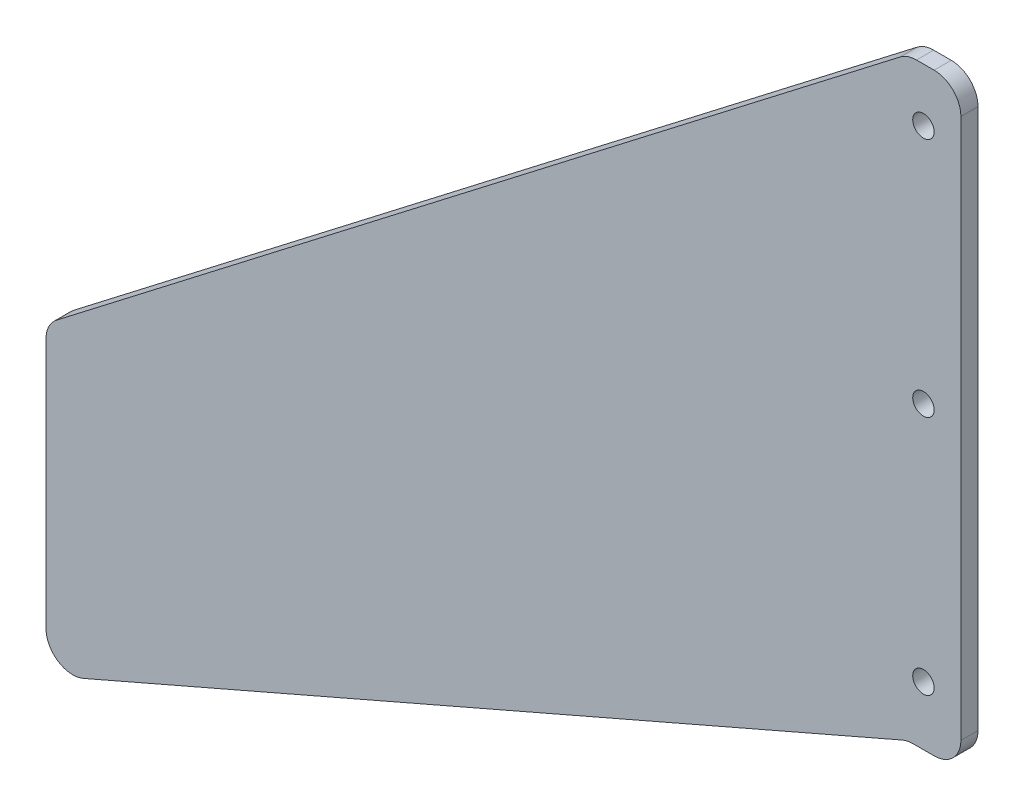
ISO-10303-21;
HEADER;
FILE_DESCRIPTION(('STEP AP214'),'2;1');
FILE_NAME('part.step','',(''),(''),'','','');
FILE_SCHEMA(('AUTOMOTIVE_DESIGN { 1 0 10303 214 1 1 1 1 }'));
ENDSEC;
DATA;
#1=APPLICATION_CONTEXT('core data for automotive mechanical design processes');
#2=APPLICATION_PROTOCOL_DEFINITION('international standard','automotive_design',2000,#1);
#3=PRODUCT_CONTEXT('',#1,'mechanical');
#4=PRODUCT('Part','Part','',(#3));
#5=PRODUCT_RELATED_PRODUCT_CATEGORY('part','',(#4));
#6=PRODUCT_DEFINITION_FORMATION('','',#4);
#7=PRODUCT_DEFINITION_CONTEXT('part definition',#1,'design');
#8=PRODUCT_DEFINITION('design','',#6,#7);
#9=PRODUCT_DEFINITION_SHAPE('','',#8);
#10=(LENGTH_UNIT() NAMED_UNIT(*) SI_UNIT(.MILLI.,.METRE.));
#11=(NAMED_UNIT(*) PLANE_ANGLE_UNIT() SI_UNIT($,.RADIAN.));
#12=(NAMED_UNIT(*) SI_UNIT($,.STERADIAN.) SOLID_ANGLE_UNIT());
#13=UNCERTAINTY_MEASURE_WITH_UNIT(LENGTH_MEASURE(1.E-05),#10,'distance_accuracy_value','');
#14=(GEOMETRIC_REPRESENTATION_CONTEXT(3) GLOBAL_UNCERTAINTY_ASSIGNED_CONTEXT((#13)) GLOBAL_UNIT_ASSIGNED_CONTEXT((#10,
#11,#12)) REPRESENTATION_CONTEXT('',''));
#15=CARTESIAN_POINT('',(0.,0.,0.));
#16=DIRECTION('',(0.,0.,1.));
#17=DIRECTION('',(1.,0.,0.));
#18=AXIS2_PLACEMENT_3D('',#15,#16,#17);
#19=CARTESIAN_POINT('',(-1.29771640413357,4.99999999999951,1.6));
#20=DIRECTION('',(0.,0.,1.));
#21=DIRECTION('',(1.,0.,0.));
#22=AXIS2_PLACEMENT_3D('',#19,#20,#21);
#23=PLANE('',#22);
#24=CARTESIAN_POINT('',(-8.19440001964544E-13,-45.0000000000005,1.6));
#25=DIRECTION('',(0.,0.,1.));
#26=DIRECTION('',(1.,0.,0.));
#27=AXIS2_PLACEMENT_3D('',#24,#25,#26);
#28=CIRCLE('',#27,2.);
#29=CARTESIAN_POINT('',(1.99999999999918,-45.0000000000005,1.6));
#30=VERTEX_POINT('',#29);
#31=EDGE_CURVE('E183',#30,#30,#28,.T.);
#32=ORIENTED_EDGE('',*,*,#31,.F.);
#33=EDGE_LOOP('',(#32));
#34=FACE_BOUND('',#33,.T.);
#35=CARTESIAN_POINT('',(-1.29771640413357,4.99999999999951,1.6));
#36=DIRECTION('',(0.,0.,1.));
#37=DIRECTION('',(1.,0.,0.));
#38=AXIS2_PLACEMENT_3D('',#35,#36,#37);
#39=CIRCLE('',#38,5.00000000000015);
#40=CARTESIAN_POINT('',(-1.29771640413357,9.99999999999984,1.6));
#41=VERTEX_POINT('',#40);
#42=CARTESIAN_POINT('',(-4.34864776888282,8.9612899171337,1.6));
#43=VERTEX_POINT('',#42);
#44=EDGE_CURVE('E189',#41,#43,#39,.T.);
#45=ORIENTED_EDGE('',*,*,#44,.T.);
#46=DIRECTION('',(-0.792257983426843,-0.610186272949853,0.));
#47=VECTOR('',#46,1.);
#48=CARTESIAN_POINT('',(-4.34864776888282,8.9612899171337,1.6));
#49=LINE('',#48,#47);
#50=CARTESIAN_POINT('',(-162.050931364752,-112.498853970365,1.6));
#51=VERTEX_POINT('',#50);
#52=EDGE_CURVE('E130',#43,#51,#49,.T.);
#53=ORIENTED_EDGE('',*,*,#52,.T.);
#54=CARTESIAN_POINT('',(-159.000000000003,-116.460143887499,1.6));
#55=DIRECTION('',(0.,0.,1.));
#56=DIRECTION('',(1.,0.,0.));
#57=AXIS2_PLACEMENT_3D('',#54,#55,#56);
#58=CIRCLE('',#57,4.99999999999997);
#59=CARTESIAN_POINT('',(-164.000000000002,-116.460143887499,1.6));
#60=VERTEX_POINT('',#59);
#61=EDGE_CURVE('E192',#51,#60,#58,.T.);
#62=ORIENTED_EDGE('',*,*,#61,.T.);
#63=DIRECTION('',(0.,-1.,0.));
#64=VECTOR('',#63,1.);
#65=CARTESIAN_POINT('',(-164.000000000002,-116.460143887499,1.6));
#66=LINE('',#65,#64);
#67=CARTESIAN_POINT('',(-164.000000000003,-163.373940780875,1.6));
#68=VERTEX_POINT('',#67);
#69=EDGE_CURVE('E194',#60,#68,#66,.T.);
#70=ORIENTED_EDGE('',*,*,#69,.T.);
#71=CARTESIAN_POINT('',(-159.000000000003,-163.373940780876,1.6));
#72=DIRECTION('',(0.,0.,1.));
#73=DIRECTION('',(1.,0.,0.));
#74=AXIS2_PLACEMENT_3D('',#71,#72,#73);
#75=CIRCLE('',#74,5.00000000000006);
#76=CARTESIAN_POINT('',(-157.006369442931,-167.959291062142,1.6));
#77=VERTEX_POINT('',#76);
#78=EDGE_CURVE('E196',#68,#77,#75,.T.);
#79=ORIENTED_EDGE('',*,*,#78,.T.);
#80=DIRECTION('',(0.917070056253239,0.398726111414441,0.));
#81=VECTOR('',#80,1.);
#82=CARTESIAN_POINT('',(-157.006369442931,-167.959291062142,1.6));
#83=LINE('',#82,#81);
#84=CARTESIAN_POINT('',(-3.95369435308959,-101.414649718734,1.6));
#85=VERTEX_POINT('',#84);
#86=EDGE_CURVE('E198',#77,#85,#83,.T.);
#87=ORIENTED_EDGE('',*,*,#86,.T.);
#88=CARTESIAN_POINT('',(-1.96006379601695,-106.000000000001,1.6));
#89=DIRECTION('',(0.,0.,-1.));
#90=DIRECTION('',(1.,0.,0.));
#91=AXIS2_PLACEMENT_3D('',#88,#89,#90);
#92=CIRCLE('',#91,5.00000000000025);
#93=CARTESIAN_POINT('',(-1.96006379601744,-101.000000000001,1.6));
#94=VERTEX_POINT('',#93);
#95=EDGE_CURVE('E200',#85,#94,#92,.T.);
#96=ORIENTED_EDGE('',*,*,#95,.T.);
#97=DIRECTION('',(1.,0.,0.));
#98=VECTOR('',#97,1.);
#99=CARTESIAN_POINT('',(-1.96006379601744,-101.000000000001,1.6));
#100=LINE('',#99,#98);
#101=CARTESIAN_POINT('',(1.99999999999848,-101.000000000001,1.6));
#102=VERTEX_POINT('',#101);
#103=EDGE_CURVE('E202',#94,#102,#100,.T.);
#104=ORIENTED_EDGE('',*,*,#103,.T.);
#105=CARTESIAN_POINT('',(1.99999999999824,-96.0000000000007,1.6));
#106=DIRECTION('',(0.,0.,1.));
#107=DIRECTION('',(1.,0.,0.));
#108=AXIS2_PLACEMENT_3D('',#105,#106,#107);
#109=CIRCLE('',#108,4.9999999999999);
#110=CARTESIAN_POINT('',(6.99999999999853,-96.0000000000009,1.6));
#111=VERTEX_POINT('',#110);
#112=EDGE_CURVE('E204',#102,#111,#109,.T.);
#113=ORIENTED_EDGE('',*,*,#112,.T.);
#114=DIRECTION('',(0.,1.,0.));
#115=VECTOR('',#114,1.);
#116=CARTESIAN_POINT('',(6.99999999999853,-96.0000000000009,1.6));
#117=LINE('',#116,#115);
#118=CARTESIAN_POINT('',(6.99999999999945,4.99999999999943,1.6));
#119=VERTEX_POINT('',#118);
#120=EDGE_CURVE('E206',#111,#119,#117,.T.);
#121=ORIENTED_EDGE('',*,*,#120,.T.);
#122=CARTESIAN_POINT('',(1.99999999999925,4.99999999999962,1.6));
#123=DIRECTION('',(0.,0.,1.));
#124=DIRECTION('',(1.,0.,0.));
#125=AXIS2_PLACEMENT_3D('',#122,#123,#124);
#126=CIRCLE('',#125,5.0000000000002);
#127=CARTESIAN_POINT('',(1.9999999999994,9.99999999999984,1.6));
#128=VERTEX_POINT('',#127);
#129=EDGE_CURVE('E58',#119,#128,#126,.T.);
#130=ORIENTED_EDGE('',*,*,#129,.T.);
#131=DIRECTION('',(-1.,0.,0.));
#132=VECTOR('',#131,1.);
#133=CARTESIAN_POINT('',(1.9999999999994,9.99999999999984,1.6));
#134=LINE('',#133,#132);
#135=EDGE_CURVE('E53',#128,#41,#134,.T.);
#136=ORIENTED_EDGE('',*,*,#135,.T.);
#137=EDGE_LOOP('',(#45,#53,#62,#70,#79,#87,#96,#104,#113,#121,#130,#136));
#138=FACE_BOUND('',#137,.T.);
#139=CARTESIAN_POINT('',(0.,0.,1.6));
#140=DIRECTION('',(0.,0.,1.));
#141=DIRECTION('',(1.,0.,0.));
#142=AXIS2_PLACEMENT_3D('',#139,#140,#141);
#143=CIRCLE('',#142,2.00000000000001);
#144=CARTESIAN_POINT('',(2.00000000000001,0.,1.6));
#145=VERTEX_POINT('',#144);
#146=EDGE_CURVE('E186',#145,#145,#143,.T.);
#147=ORIENTED_EDGE('',*,*,#146,.F.);
#148=EDGE_LOOP('',(#147));
#149=FACE_BOUND('',#148,.T.);
#150=CARTESIAN_POINT('',(-1.19956128363796E-12,-90.0000000000008,1.6));
#151=DIRECTION('',(0.,0.,1.));
#152=DIRECTION('',(1.,0.,0.));
#153=AXIS2_PLACEMENT_3D('',#150,#151,#152);
#154=CIRCLE('',#153,2.);
#155=CARTESIAN_POINT('',(1.9999999999988,-90.0000000000008,1.6));
#156=VERTEX_POINT('',#155);
#157=EDGE_CURVE('E180',#156,#156,#154,.T.);
#158=ORIENTED_EDGE('',*,*,#157,.F.);
#159=EDGE_LOOP('',(#158));
#160=FACE_BOUND('',#159,.T.);
#161=ADVANCED_FACE('F38',(#34,#138,#149,#160),#23,.T.);
#162=CARTESIAN_POINT('',(-1.29771640413357,4.99999999999951,1.6));
#163=DIRECTION('',(0.,0.,-1.));
#164=DIRECTION('',(-1.,0.,0.));
#165=AXIS2_PLACEMENT_3D('',#162,#163,#164);
#166=CYLINDRICAL_SURFACE('',#165,5.00000000000015);
#167=DIRECTION('',(0.,0.,-1.));
#168=VECTOR('',#167,1.);
#169=CARTESIAN_POINT('',(-1.29771640413357,9.99999999999984,1.6));
#170=LINE('',#169,#168);
#171=CARTESIAN_POINT('',(-1.29771640413357,9.99999999999984,-1.6));
#172=VERTEX_POINT('',#171);
#173=EDGE_CURVE('E145',#41,#172,#170,.T.);
#174=ORIENTED_EDGE('',*,*,#173,.T.);
#175=CARTESIAN_POINT('',(-1.29771640413357,4.99999999999951,-1.6));
#176=DIRECTION('',(0.,0.,1.));
#177=DIRECTION('',(1.,0.,0.));
#178=AXIS2_PLACEMENT_3D('',#175,#176,#177);
#179=CIRCLE('',#178,5.00000000000015);
#180=CARTESIAN_POINT('',(-4.34864776888282,8.9612899171337,-1.6));
#181=VERTEX_POINT('',#180);
#182=EDGE_CURVE('E139',#172,#181,#179,.T.);
#183=ORIENTED_EDGE('',*,*,#182,.T.);
#184=DIRECTION('',(0.,0.,-1.));
#185=VECTOR('',#184,1.);
#186=CARTESIAN_POINT('',(-4.34864776888282,8.9612899171337,1.6));
#187=LINE('',#186,#185);
#188=EDGE_CURVE('E11',#43,#181,#187,.T.);
#189=ORIENTED_EDGE('',*,*,#188,.F.);
#190=ORIENTED_EDGE('',*,*,#44,.F.);
#191=EDGE_LOOP('',(#174,#183,#189,#190));
#192=FACE_BOUND('',#191,.T.);
#193=ADVANCED_FACE('F40',(#192),#166,.T.);
#194=CARTESIAN_POINT('',(-4.34864776888282,8.9612899171337,1.6));
#195=DIRECTION('',(0.610186272949852,-0.792257983426843,0.));
#196=DIRECTION('',(0.792257983426843,0.610186272949853,0.));
#197=AXIS2_PLACEMENT_3D('',#194,#195,#196);
#198=PLANE('',#197);
#199=ORIENTED_EDGE('',*,*,#188,.T.);
#200=DIRECTION('',(-0.792257983426843,-0.610186272949853,0.));
#201=VECTOR('',#200,1.);
#202=CARTESIAN_POINT('',(-4.34864776888282,8.9612899171337,-1.6));
#203=LINE('',#202,#201);
#204=CARTESIAN_POINT('',(-162.050931364752,-112.498853970365,-1.6));
#205=VERTEX_POINT('',#204);
#206=EDGE_CURVE('E129',#181,#205,#203,.T.);
#207=ORIENTED_EDGE('',*,*,#206,.T.);
#208=DIRECTION('',(0.,0.,-1.));
#209=VECTOR('',#208,1.);
#210=CARTESIAN_POINT('',(-162.050931364752,-112.498853970365,1.6));
#211=LINE('',#210,#209);
#212=EDGE_CURVE('E46',#51,#205,#211,.T.);
#213=ORIENTED_EDGE('',*,*,#212,.F.);
#214=ORIENTED_EDGE('',*,*,#52,.F.);
#215=EDGE_LOOP('',(#199,#207,#213,#214));
#216=FACE_BOUND('',#215,.T.);
#217=ADVANCED_FACE('F127',(#216),#198,.F.);
#218=CARTESIAN_POINT('',(-159.000000000003,-116.460143887499,1.6));
#219=DIRECTION('',(0.,0.,-1.));
#220=DIRECTION('',(-1.,0.,0.));
#221=AXIS2_PLACEMENT_3D('',#218,#219,#220);
#222=CYLINDRICAL_SURFACE('',#221,4.99999999999997);
#223=ORIENTED_EDGE('',*,*,#212,.T.);
#224=CARTESIAN_POINT('',(-159.000000000003,-116.460143887499,-1.6));
#225=DIRECTION('',(0.,0.,1.));
#226=DIRECTION('',(1.,0.,0.));
#227=AXIS2_PLACEMENT_3D('',#224,#225,#226);
#228=CIRCLE('',#227,4.99999999999997);
#229=CARTESIAN_POINT('',(-164.000000000002,-116.460143887499,-1.6));
#230=VERTEX_POINT('',#229);
#231=EDGE_CURVE('E143',#205,#230,#228,.T.);
#232=ORIENTED_EDGE('',*,*,#231,.T.);
#233=DIRECTION('',(0.,0.,-1.));
#234=VECTOR('',#233,1.);
#235=CARTESIAN_POINT('',(-164.000000000002,-116.460143887499,1.6));
#236=LINE('',#235,#234);
#237=EDGE_CURVE('E227',#60,#230,#236,.T.);
#238=ORIENTED_EDGE('',*,*,#237,.F.);
#239=ORIENTED_EDGE('',*,*,#61,.F.);
#240=EDGE_LOOP('',(#223,#232,#238,#239));
#241=FACE_BOUND('',#240,.T.);
#242=ADVANCED_FACE('F230',(#241),#222,.T.);
#243=CARTESIAN_POINT('',(-164.000000000002,-116.460143887499,1.6));
#244=DIRECTION('',(1.,0.,0.));
#245=DIRECTION('',(0.,1.,0.));
#246=AXIS2_PLACEMENT_3D('',#243,#244,#245);
#247=PLANE('',#246);
#248=ORIENTED_EDGE('',*,*,#237,.T.);
#249=DIRECTION('',(0.,-1.,0.));
#250=VECTOR('',#249,1.);
#251=CARTESIAN_POINT('',(-164.000000000002,-116.460143887499,-1.6));
#252=LINE('',#251,#250);
#253=CARTESIAN_POINT('',(-164.000000000003,-163.373940780875,-1.6));
#254=VERTEX_POINT('',#253);
#255=EDGE_CURVE('E154',#230,#254,#252,.T.);
#256=ORIENTED_EDGE('',*,*,#255,.T.);
#257=DIRECTION('',(0.,0.,-1.));
#258=VECTOR('',#257,1.);
#259=CARTESIAN_POINT('',(-164.000000000003,-163.373940780875,1.6));
#260=LINE('',#259,#258);
#261=EDGE_CURVE('E225',#68,#254,#260,.T.);
#262=ORIENTED_EDGE('',*,*,#261,.F.);
#263=ORIENTED_EDGE('',*,*,#69,.F.);
#264=EDGE_LOOP('',(#248,#256,#262,#263));
#265=FACE_BOUND('',#264,.T.);
#266=ADVANCED_FACE('F238',(#265),#247,.F.);
#267=CARTESIAN_POINT('',(-159.000000000003,-163.373940780876,1.6));
#268=DIRECTION('',(0.,0.,-1.));
#269=DIRECTION('',(-1.,0.,0.));
#270=AXIS2_PLACEMENT_3D('',#267,#268,#269);
#271=CYLINDRICAL_SURFACE('',#270,5.00000000000006);
#272=ORIENTED_EDGE('',*,*,#261,.T.);
#273=CARTESIAN_POINT('',(-159.000000000003,-163.373940780876,-1.6));
#274=DIRECTION('',(0.,0.,1.));
#275=DIRECTION('',(1.,0.,0.));
#276=AXIS2_PLACEMENT_3D('',#273,#274,#275);
#277=CIRCLE('',#276,5.00000000000006);
#278=CARTESIAN_POINT('',(-157.006369442931,-167.959291062142,-1.6));
#279=VERTEX_POINT('',#278);
#280=EDGE_CURVE('E157',#254,#279,#277,.T.);
#281=ORIENTED_EDGE('',*,*,#280,.T.);
#282=DIRECTION('',(0.,0.,-1.));
#283=VECTOR('',#282,1.);
#284=CARTESIAN_POINT('',(-157.006369442931,-167.959291062142,1.6));
#285=LINE('',#284,#283);
#286=EDGE_CURVE('E223',#77,#279,#285,.T.);
#287=ORIENTED_EDGE('',*,*,#286,.F.);
#288=ORIENTED_EDGE('',*,*,#78,.F.);
#289=EDGE_LOOP('',(#272,#281,#287,#288));
#290=FACE_BOUND('',#289,.T.);
#291=ADVANCED_FACE('F241',(#290),#271,.T.);
#292=CARTESIAN_POINT('',(-157.006369442931,-167.959291062142,1.6));
#293=DIRECTION('',(-0.398726111414441,0.917070056253239,0.));
#294=DIRECTION('',(-0.917070056253239,-0.398726111414441,0.));
#295=AXIS2_PLACEMENT_3D('',#292,#293,#294);
#296=PLANE('',#295);
#297=ORIENTED_EDGE('',*,*,#286,.T.);
#298=DIRECTION('',(0.917070056253239,0.398726111414441,0.));
#299=VECTOR('',#298,1.);
#300=CARTESIAN_POINT('',(-157.006369442931,-167.959291062142,-1.6));
#301=LINE('',#300,#299);
#302=CARTESIAN_POINT('',(-3.95369435308959,-101.414649718734,-1.6));
#303=VERTEX_POINT('',#302);
#304=EDGE_CURVE('E160',#279,#303,#301,.T.);
#305=ORIENTED_EDGE('',*,*,#304,.T.);
#306=DIRECTION('',(0.,0.,-1.));
#307=VECTOR('',#306,1.);
#308=CARTESIAN_POINT('',(-3.95369435308959,-101.414649718734,1.6));
#309=LINE('',#308,#307);
#310=EDGE_CURVE('E221',#85,#303,#309,.T.);
#311=ORIENTED_EDGE('',*,*,#310,.F.);
#312=ORIENTED_EDGE('',*,*,#86,.F.);
#313=EDGE_LOOP('',(#297,#305,#311,#312));
#314=FACE_BOUND('',#313,.T.);
#315=ADVANCED_FACE('F246',(#314),#296,.F.);
#316=CARTESIAN_POINT('',(-1.96006379601695,-106.000000000001,1.6));
#317=DIRECTION('',(0.,0.,-1.));
#318=DIRECTION('',(-1.,0.,0.));
#319=AXIS2_PLACEMENT_3D('',#316,#317,#318);
#320=CYLINDRICAL_SURFACE('',#319,5.00000000000025);
#321=ORIENTED_EDGE('',*,*,#310,.T.);
#322=CARTESIAN_POINT('',(-1.96006379601695,-106.000000000001,-1.6));
#323=DIRECTION('',(0.,0.,-1.));
#324=DIRECTION('',(1.,0.,0.));
#325=AXIS2_PLACEMENT_3D('',#322,#323,#324);
#326=CIRCLE('',#325,5.00000000000025);
#327=CARTESIAN_POINT('',(-1.96006379601744,-101.000000000001,-1.6));
#328=VERTEX_POINT('',#327);
#329=EDGE_CURVE('E163',#303,#328,#326,.T.);
#330=ORIENTED_EDGE('',*,*,#329,.T.);
#331=DIRECTION('',(0.,0.,-1.));
#332=VECTOR('',#331,1.);
#333=CARTESIAN_POINT('',(-1.96006379601744,-101.000000000001,1.6));
#334=LINE('',#333,#332);
#335=EDGE_CURVE('E219',#94,#328,#334,.T.);
#336=ORIENTED_EDGE('',*,*,#335,.F.);
#337=ORIENTED_EDGE('',*,*,#95,.F.);
#338=EDGE_LOOP('',(#321,#330,#336,#337));
#339=FACE_BOUND('',#338,.T.);
#340=ADVANCED_FACE('F252',(#339),#320,.F.);
#341=CARTESIAN_POINT('',(-1.96006379601744,-101.000000000001,1.6));
#342=DIRECTION('',(0.,1.,0.));
#343=DIRECTION('',(-1.,0.,0.));
#344=AXIS2_PLACEMENT_3D('',#341,#342,#343);
#345=PLANE('',#344);
#346=ORIENTED_EDGE('',*,*,#335,.T.);
#347=DIRECTION('',(1.,0.,0.));
#348=VECTOR('',#347,1.);
#349=CARTESIAN_POINT('',(-1.96006379601744,-101.000000000001,-1.6));
#350=LINE('',#349,#348);
#351=CARTESIAN_POINT('',(1.99999999999848,-101.000000000001,-1.6));
#352=VERTEX_POINT('',#351);
#353=EDGE_CURVE('E166',#328,#352,#350,.T.);
#354=ORIENTED_EDGE('',*,*,#353,.T.);
#355=DIRECTION('',(0.,0.,-1.));
#356=VECTOR('',#355,1.);
#357=CARTESIAN_POINT('',(1.99999999999848,-101.000000000001,1.6));
#358=LINE('',#357,#356);
#359=EDGE_CURVE('E217',#102,#352,#358,.T.);
#360=ORIENTED_EDGE('',*,*,#359,.F.);
#361=ORIENTED_EDGE('',*,*,#103,.F.);
#362=EDGE_LOOP('',(#346,#354,#360,#361));
#363=FACE_BOUND('',#362,.T.);
#364=ADVANCED_FACE('F256',(#363),#345,.F.);
#365=CARTESIAN_POINT('',(1.99999999999824,-96.0000000000007,1.6));
#366=DIRECTION('',(0.,0.,-1.));
#367=DIRECTION('',(-1.,0.,0.));
#368=AXIS2_PLACEMENT_3D('',#365,#366,#367);
#369=CYLINDRICAL_SURFACE('',#368,5.00000000000013);
#370=ORIENTED_EDGE('',*,*,#359,.T.);
#371=CARTESIAN_POINT('',(1.99999999999824,-96.0000000000007,-1.6));
#372=DIRECTION('',(0.,0.,1.));
#373=DIRECTION('',(1.,0.,0.));
#374=AXIS2_PLACEMENT_3D('',#371,#372,#373);
#375=CIRCLE('',#374,4.9999999999999);
#376=CARTESIAN_POINT('',(6.99999999999853,-96.0000000000009,-1.6));
#377=VERTEX_POINT('',#376);
#378=EDGE_CURVE('E169',#352,#377,#375,.T.);
#379=ORIENTED_EDGE('',*,*,#378,.T.);
#380=DIRECTION('',(0.,0.,-1.));
#381=VECTOR('',#380,1.);
#382=CARTESIAN_POINT('',(6.99999999999853,-96.0000000000009,1.6));
#383=LINE('',#382,#381);
#384=EDGE_CURVE('E215',#111,#377,#383,.T.);
#385=ORIENTED_EDGE('',*,*,#384,.F.);
#386=ORIENTED_EDGE('',*,*,#112,.F.);
#387=EDGE_LOOP('',(#370,#379,#385,#386));
#388=FACE_BOUND('',#387,.T.);
#389=ADVANCED_FACE('F261',(#388),#369,.T.);
#390=CARTESIAN_POINT('',(6.99999999999853,-96.0000000000009,1.6));
#391=DIRECTION('',(-1.,0.,0.));
#392=DIRECTION('',(0.,-1.,0.));
#393=AXIS2_PLACEMENT_3D('',#390,#391,#392);
#394=PLANE('',#393);
#395=ORIENTED_EDGE('',*,*,#384,.T.);
#396=DIRECTION('',(0.,1.,0.));
#397=VECTOR('',#396,1.);
#398=CARTESIAN_POINT('',(6.99999999999853,-96.0000000000009,-1.6));
#399=LINE('',#398,#397);
#400=CARTESIAN_POINT('',(6.99999999999945,4.99999999999943,-1.6));
#401=VERTEX_POINT('',#400);
#402=EDGE_CURVE('E172',#377,#401,#399,.T.);
#403=ORIENTED_EDGE('',*,*,#402,.T.);
#404=DIRECTION('',(0.,0.,-1.));
#405=VECTOR('',#404,1.);
#406=CARTESIAN_POINT('',(6.99999999999945,4.99999999999943,1.6));
#407=LINE('',#406,#405);
#408=EDGE_CURVE('E213',#119,#401,#407,.T.);
#409=ORIENTED_EDGE('',*,*,#408,.F.);
#410=ORIENTED_EDGE('',*,*,#120,.F.);
#411=EDGE_LOOP('',(#395,#403,#409,#410));
#412=FACE_BOUND('',#411,.T.);
#413=ADVANCED_FACE('F265',(#412),#394,.F.);
#414=CARTESIAN_POINT('',(1.99999999999925,4.99999999999962,1.6));
#415=DIRECTION('',(0.,0.,-1.));
#416=DIRECTION('',(-1.,0.,0.));
#417=AXIS2_PLACEMENT_3D('',#414,#415,#416);
#418=CYLINDRICAL_SURFACE('',#417,5.0000000000002);
#419=ORIENTED_EDGE('',*,*,#408,.T.);
#420=CARTESIAN_POINT('',(1.99999999999925,4.99999999999962,-1.6));
#421=DIRECTION('',(0.,0.,1.));
#422=DIRECTION('',(1.,0.,0.));
#423=AXIS2_PLACEMENT_3D('',#420,#421,#422);
#424=CIRCLE('',#423,5.0000000000002);
#425=CARTESIAN_POINT('',(1.9999999999994,9.99999999999984,-1.6));
#426=VERTEX_POINT('',#425);
#427=EDGE_CURVE('E175',#401,#426,#424,.T.);
#428=ORIENTED_EDGE('',*,*,#427,.T.);
#429=DIRECTION('',(0.,0.,-1.));
#430=VECTOR('',#429,1.);
#431=CARTESIAN_POINT('',(1.9999999999994,9.99999999999984,1.6));
#432=LINE('',#431,#430);
#433=EDGE_CURVE('E211',#128,#426,#432,.T.);
#434=ORIENTED_EDGE('',*,*,#433,.F.);
#435=ORIENTED_EDGE('',*,*,#129,.F.);
#436=EDGE_LOOP('',(#419,#428,#434,#435));
#437=FACE_BOUND('',#436,.T.);
#438=ADVANCED_FACE('F269',(#437),#418,.T.);
#439=CARTESIAN_POINT('',(1.9999999999994,9.99999999999984,1.6));
#440=DIRECTION('',(0.,-1.,0.));
#441=DIRECTION('',(0.,0.,-1.));
#442=AXIS2_PLACEMENT_3D('',#439,#440,#441);
#443=PLANE('',#442);
#444=ORIENTED_EDGE('',*,*,#433,.T.);
#445=DIRECTION('',(-1.,0.,0.));
#446=VECTOR('',#445,1.);
#447=CARTESIAN_POINT('',(1.9999999999994,9.99999999999984,-1.6));
#448=LINE('',#447,#446);
#449=EDGE_CURVE('E178',#426,#172,#448,.T.);
#450=ORIENTED_EDGE('',*,*,#449,.T.);
#451=ORIENTED_EDGE('',*,*,#173,.F.);
#452=ORIENTED_EDGE('',*,*,#135,.F.);
#453=EDGE_LOOP('',(#444,#450,#451,#452));
#454=FACE_BOUND('',#453,.T.);
#455=ADVANCED_FACE('F271',(#454),#443,.F.);
#456=CARTESIAN_POINT('',(0.,0.,1.6));
#457=DIRECTION('',(0.,0.,-1.));
#458=DIRECTION('',(-1.,0.,0.));
#459=AXIS2_PLACEMENT_3D('',#456,#457,#458);
#460=CYLINDRICAL_SURFACE('',#459,2.00000000000001);
#461=ORIENTED_EDGE('',*,*,#146,.T.);
#462=EDGE_LOOP('',(#461));
#463=FACE_BOUND('',#462,.T.);
#464=CARTESIAN_POINT('',(0.,0.,-1.6));
#465=DIRECTION('',(0.,0.,1.));
#466=DIRECTION('',(1.,0.,0.));
#467=AXIS2_PLACEMENT_3D('',#464,#465,#466);
#468=CIRCLE('',#467,2.00000000000001);
#469=CARTESIAN_POINT('',(2.00000000000001,0.,-1.6));
#470=VERTEX_POINT('',#469);
#471=EDGE_CURVE('E146',#470,#470,#468,.T.);
#472=ORIENTED_EDGE('',*,*,#471,.F.);
#473=EDGE_LOOP('',(#472));
#474=FACE_BOUND('',#473,.T.);
#475=ADVANCED_FACE('F273',(#463,#474),#460,.F.);
#476=CARTESIAN_POINT('',(-8.19440001964544E-13,-45.0000000000005,1.6));
#477=DIRECTION('',(0.,0.,-1.));
#478=DIRECTION('',(-1.,0.,0.));
#479=AXIS2_PLACEMENT_3D('',#476,#477,#478);
#480=CYLINDRICAL_SURFACE('',#479,2.);
#481=ORIENTED_EDGE('',*,*,#31,.T.);
#482=EDGE_LOOP('',(#481));
#483=FACE_BOUND('',#482,.T.);
#484=CARTESIAN_POINT('',(-8.19440001964544E-13,-45.0000000000005,-1.6));
#485=DIRECTION('',(0.,0.,1.));
#486=DIRECTION('',(1.,0.,0.));
#487=AXIS2_PLACEMENT_3D('',#484,#485,#486);
#488=CIRCLE('',#487,2.);
#489=CARTESIAN_POINT('',(1.99999999999918,-45.0000000000005,-1.6));
#490=VERTEX_POINT('',#489);
#491=EDGE_CURVE('E149',#490,#490,#488,.T.);
#492=ORIENTED_EDGE('',*,*,#491,.F.);
#493=EDGE_LOOP('',(#492));
#494=FACE_BOUND('',#493,.T.);
#495=ADVANCED_FACE('F279',(#483,#494),#480,.F.);
#496=CARTESIAN_POINT('',(-1.19956128363796E-12,-90.0000000000008,1.6));
#497=DIRECTION('',(0.,0.,-1.));
#498=DIRECTION('',(-1.,0.,0.));
#499=AXIS2_PLACEMENT_3D('',#496,#497,#498);
#500=CYLINDRICAL_SURFACE('',#499,2.);
#501=ORIENTED_EDGE('',*,*,#157,.T.);
#502=EDGE_LOOP('',(#501));
#503=FACE_BOUND('',#502,.T.);
#504=CARTESIAN_POINT('',(-1.19956128363796E-12,-90.0000000000008,-1.6));
#505=DIRECTION('',(0.,0.,1.));
#506=DIRECTION('',(1.,0.,0.));
#507=AXIS2_PLACEMENT_3D('',#504,#505,#506);
#508=CIRCLE('',#507,2.);
#509=CARTESIAN_POINT('',(1.9999999999988,-90.0000000000008,-1.6));
#510=VERTEX_POINT('',#509);
#511=EDGE_CURVE('E305',#510,#510,#508,.T.);
#512=ORIENTED_EDGE('',*,*,#511,.F.);
#513=EDGE_LOOP('',(#512));
#514=FACE_BOUND('',#513,.T.);
#515=ADVANCED_FACE('F293',(#503,#514),#500,.F.);
#516=CARTESIAN_POINT('',(-1.29771640413357,4.99999999999951,-1.6));
#517=DIRECTION('',(0.,0.,1.));
#518=DIRECTION('',(1.,0.,0.));
#519=AXIS2_PLACEMENT_3D('',#516,#517,#518);
#520=PLANE('',#519);
#521=ORIENTED_EDGE('',*,*,#511,.T.);
#522=EDGE_LOOP('',(#521));
#523=FACE_BOUND('',#522,.T.);
#524=ORIENTED_EDGE('',*,*,#491,.T.);
#525=EDGE_LOOP('',(#524));
#526=FACE_BOUND('',#525,.T.);
#527=ORIENTED_EDGE('',*,*,#471,.T.);
#528=EDGE_LOOP('',(#527));
#529=FACE_BOUND('',#528,.T.);
#530=ORIENTED_EDGE('',*,*,#182,.F.);
#531=ORIENTED_EDGE('',*,*,#449,.F.);
#532=ORIENTED_EDGE('',*,*,#427,.F.);
#533=ORIENTED_EDGE('',*,*,#402,.F.);
#534=ORIENTED_EDGE('',*,*,#378,.F.);
#535=ORIENTED_EDGE('',*,*,#353,.F.);
#536=ORIENTED_EDGE('',*,*,#329,.F.);
#537=ORIENTED_EDGE('',*,*,#304,.F.);
#538=ORIENTED_EDGE('',*,*,#280,.F.);
#539=ORIENTED_EDGE('',*,*,#255,.F.);
#540=ORIENTED_EDGE('',*,*,#231,.F.);
#541=ORIENTED_EDGE('',*,*,#206,.F.);
#542=EDGE_LOOP('',(#530,#531,#532,#533,#534,#535,#536,#537,#538,#539,#540,#541));
#543=FACE_BOUND('',#542,.T.);
#544=ADVANCED_FACE('F137',(#523,#526,#529,#543),#520,.F.);
#545=CLOSED_SHELL('',(#161,#193,#217,#242,#266,#291,#315,#340,#364,#389,#413,#438,#455,#475,
#495,#515,#544));
#546=MANIFOLD_SOLID_BREP('B2',#545);
#547=ADVANCED_BREP_SHAPE_REPRESENTATION('',(#18,#546),#14);
#548=SHAPE_DEFINITION_REPRESENTATION(#9,#547);
ENDSEC;
END-ISO-10303-21;
